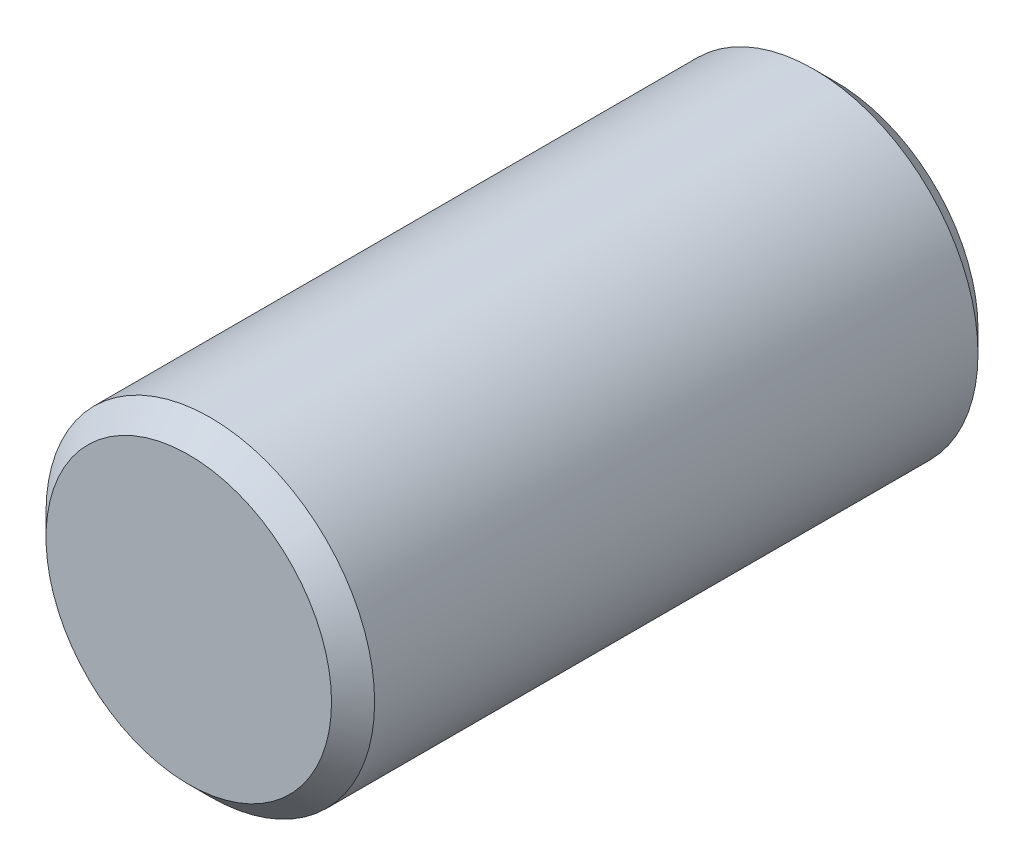
ISO-10303-21;
HEADER;
FILE_DESCRIPTION(('STEP AP214'),'2;1');
FILE_NAME('part.step','',(''),(''),'','','');
FILE_SCHEMA(('AUTOMOTIVE_DESIGN { 1 0 10303 214 1 1 1 1 }'));
ENDSEC;
DATA;
#1=APPLICATION_CONTEXT('core data for automotive mechanical design processes');
#2=APPLICATION_PROTOCOL_DEFINITION('international standard','automotive_design',2000,#1);
#3=PRODUCT_CONTEXT('',#1,'mechanical');
#4=PRODUCT('Part','Part','',(#3));
#5=PRODUCT_RELATED_PRODUCT_CATEGORY('part','',(#4));
#6=PRODUCT_DEFINITION_FORMATION('','',#4);
#7=PRODUCT_DEFINITION_CONTEXT('part definition',#1,'design');
#8=PRODUCT_DEFINITION('design','',#6,#7);
#9=PRODUCT_DEFINITION_SHAPE('','',#8);
#10=(LENGTH_UNIT() NAMED_UNIT(*) SI_UNIT(.MILLI.,.METRE.));
#11=(NAMED_UNIT(*) PLANE_ANGLE_UNIT() SI_UNIT($,.RADIAN.));
#12=(NAMED_UNIT(*) SI_UNIT($,.STERADIAN.) SOLID_ANGLE_UNIT());
#13=UNCERTAINTY_MEASURE_WITH_UNIT(LENGTH_MEASURE(1.E-05),#10,'distance_accuracy_value','');
#14=(GEOMETRIC_REPRESENTATION_CONTEXT(3) GLOBAL_UNCERTAINTY_ASSIGNED_CONTEXT((#13)) GLOBAL_UNIT_ASSIGNED_CONTEXT((#10,
#11,#12)) REPRESENTATION_CONTEXT('',''));
#15=CARTESIAN_POINT('',(0.,0.,0.));
#16=DIRECTION('',(0.,0.,1.));
#17=DIRECTION('',(1.,0.,0.));
#18=AXIS2_PLACEMENT_3D('',#15,#16,#17);
#19=CARTESIAN_POINT('',(0.,0.,6.));
#20=DIRECTION('',(0.,0.,-1.));
#21=DIRECTION('',(-1.,0.,0.));
#22=AXIS2_PLACEMENT_3D('',#19,#20,#21);
#23=CYLINDRICAL_SURFACE('',#22,1.525);
#24=CARTESIAN_POINT('',(0.,0.,5.8));
#25=DIRECTION('',(0.,0.,1.));
#26=DIRECTION('',(1.,0.,0.));
#27=AXIS2_PLACEMENT_3D('',#24,#25,#26);
#28=CIRCLE('',#27,1.525);
#29=CARTESIAN_POINT('',(1.525,0.,5.8));
#30=VERTEX_POINT('',#29);
#31=EDGE_CURVE('E49',#30,#30,#28,.F.);
#32=ORIENTED_EDGE('',*,*,#31,.T.);
#33=EDGE_LOOP('',(#32));
#34=FACE_BOUND('',#33,.T.);
#35=CARTESIAN_POINT('',(0.,0.,0.199999999999999));
#36=DIRECTION('',(0.,0.,1.));
#37=DIRECTION('',(1.,0.,0.));
#38=AXIS2_PLACEMENT_3D('',#35,#36,#37);
#39=CIRCLE('',#38,1.525);
#40=CARTESIAN_POINT('',(1.525,0.,0.199999999999999));
#41=VERTEX_POINT('',#40);
#42=EDGE_CURVE('E53',#41,#41,#39,.T.);
#43=ORIENTED_EDGE('',*,*,#42,.T.);
#44=EDGE_LOOP('',(#43));
#45=FACE_BOUND('',#44,.T.);
#46=ADVANCED_FACE('F41',(#34,#45),#23,.T.);
#47=CARTESIAN_POINT('',(0.,0.,6.));
#48=DIRECTION('',(0.,0.,1.));
#49=DIRECTION('',(1.,0.,0.));
#50=AXIS2_PLACEMENT_3D('',#47,#48,#49);
#51=PLANE('',#50);
#52=CARTESIAN_POINT('',(0.,0.,6.));
#53=DIRECTION('',(0.,0.,1.));
#54=DIRECTION('',(1.,0.,0.));
#55=AXIS2_PLACEMENT_3D('',#52,#53,#54);
#56=CIRCLE('',#55,1.325);
#57=CARTESIAN_POINT('',(1.325,0.,6.));
#58=VERTEX_POINT('',#57);
#59=EDGE_CURVE('E57',#58,#58,#56,.T.);
#60=ORIENTED_EDGE('',*,*,#59,.T.);
#61=EDGE_LOOP('',(#60));
#62=FACE_BOUND('',#61,.T.);
#63=ADVANCED_FACE('F63',(#62),#51,.T.);
#64=CARTESIAN_POINT('',(0.,0.,0.));
#65=DIRECTION('',(0.,0.,1.));
#66=DIRECTION('',(1.,0.,0.));
#67=AXIS2_PLACEMENT_3D('',#64,#65,#66);
#68=PLANE('',#67);
#69=CARTESIAN_POINT('',(0.,0.,0.));
#70=DIRECTION('',(0.,0.,1.));
#71=DIRECTION('',(1.,0.,0.));
#72=AXIS2_PLACEMENT_3D('',#69,#70,#71);
#73=CIRCLE('',#72,1.325);
#74=CARTESIAN_POINT('',(1.325,0.,0.));
#75=VERTEX_POINT('',#74);
#76=EDGE_CURVE('E10',#75,#75,#73,.F.);
#77=ORIENTED_EDGE('',*,*,#76,.T.);
#78=EDGE_LOOP('',(#77));
#79=FACE_BOUND('',#78,.T.);
#80=ADVANCED_FACE('F67',(#79),#68,.F.);
#81=CARTESIAN_POINT('',(0.,0.,6.));
#82=DIRECTION('',(0.,0.,-1.));
#83=DIRECTION('',(-1.,0.,0.));
#84=AXIS2_PLACEMENT_3D('',#81,#82,#83);
#85=CONICAL_SURFACE('',#84,1.325,0.785398163397447);
#86=ORIENTED_EDGE('',*,*,#31,.F.);
#87=EDGE_LOOP('',(#86));
#88=FACE_BOUND('',#87,.T.);
#89=ORIENTED_EDGE('',*,*,#59,.F.);
#90=EDGE_LOOP('',(#89));
#91=FACE_BOUND('',#90,.T.);
#92=ADVANCED_FACE('F65',(#88,#91),#85,.T.);
#93=CARTESIAN_POINT('',(0.,0.,0.199999999999999));
#94=DIRECTION('',(0.,0.,1.));
#95=DIRECTION('',(1.,0.,0.));
#96=AXIS2_PLACEMENT_3D('',#93,#94,#95);
#97=CONICAL_SURFACE('',#96,1.525,0.78539816339745);
#98=ORIENTED_EDGE('',*,*,#76,.F.);
#99=EDGE_LOOP('',(#98));
#100=FACE_BOUND('',#99,.T.);
#101=ORIENTED_EDGE('',*,*,#42,.F.);
#102=EDGE_LOOP('',(#101));
#103=FACE_BOUND('',#102,.T.);
#104=ADVANCED_FACE('F44',(#100,#103),#97,.T.);
#105=CLOSED_SHELL('',(#46,#63,#80,#92,#104));
#106=MANIFOLD_SOLID_BREP('B2',#105);
#107=ADVANCED_BREP_SHAPE_REPRESENTATION('',(#18,#106),#14);
#108=SHAPE_DEFINITION_REPRESENTATION(#9,#107);
ENDSEC;
END-ISO-10303-21;
